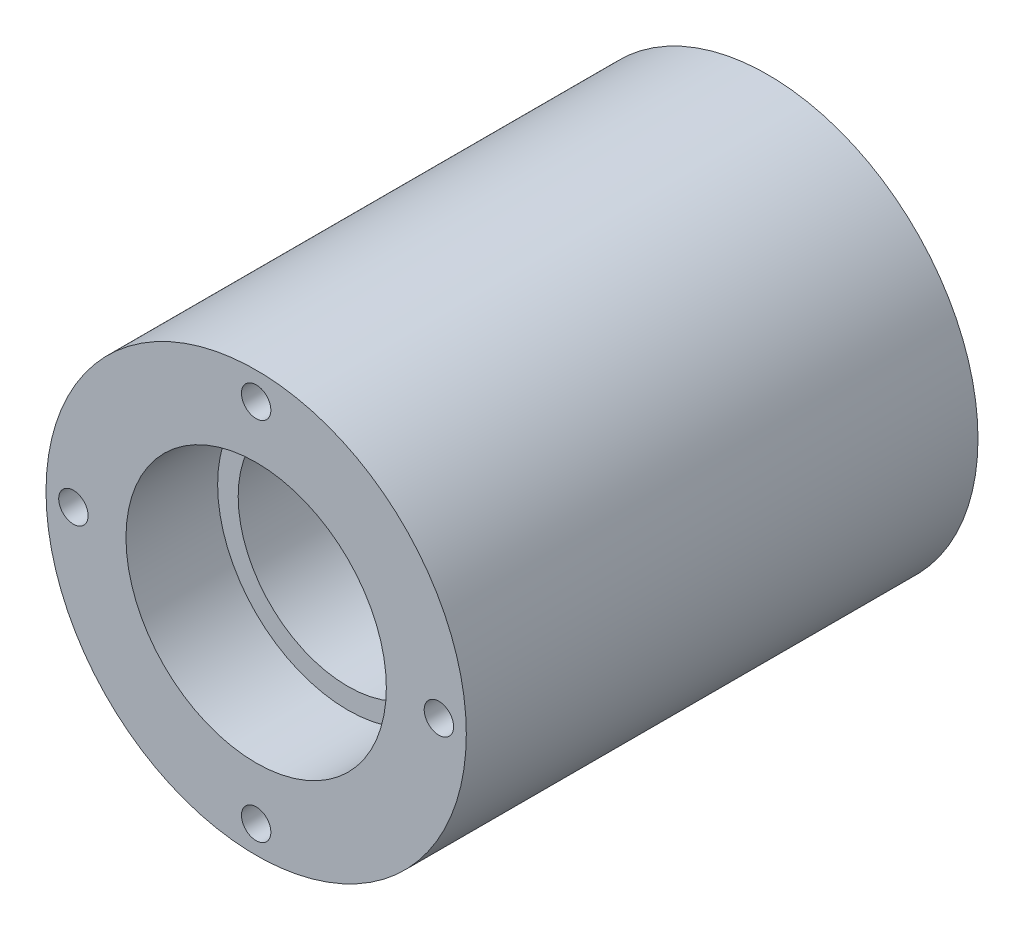
ISO-10303-21;
HEADER;
FILE_DESCRIPTION(('STEP AP214'),'2;1');
FILE_NAME('part.step','',(''),(''),'','','');
FILE_SCHEMA(('AUTOMOTIVE_DESIGN { 1 0 10303 214 1 1 1 1 }'));
ENDSEC;
DATA;
#1=APPLICATION_CONTEXT('core data for automotive mechanical design processes');
#2=APPLICATION_PROTOCOL_DEFINITION('international standard','automotive_design',2000,#1);
#3=PRODUCT_CONTEXT('',#1,'mechanical');
#4=PRODUCT('Part','Part','',(#3));
#5=PRODUCT_RELATED_PRODUCT_CATEGORY('part','',(#4));
#6=PRODUCT_DEFINITION_FORMATION('','',#4);
#7=PRODUCT_DEFINITION_CONTEXT('part definition',#1,'design');
#8=PRODUCT_DEFINITION('design','',#6,#7);
#9=PRODUCT_DEFINITION_SHAPE('','',#8);
#10=(LENGTH_UNIT() NAMED_UNIT(*) SI_UNIT(.MILLI.,.METRE.));
#11=(NAMED_UNIT(*) PLANE_ANGLE_UNIT() SI_UNIT($,.RADIAN.));
#12=(NAMED_UNIT(*) SI_UNIT($,.STERADIAN.) SOLID_ANGLE_UNIT());
#13=UNCERTAINTY_MEASURE_WITH_UNIT(LENGTH_MEASURE(1.E-05),#10,'distance_accuracy_value','');
#14=(GEOMETRIC_REPRESENTATION_CONTEXT(3) GLOBAL_UNCERTAINTY_ASSIGNED_CONTEXT((#13)) GLOBAL_UNIT_ASSIGNED_CONTEXT((#10,
#11,#12)) REPRESENTATION_CONTEXT('',''));
#15=CARTESIAN_POINT('',(0.,0.,0.));
#16=DIRECTION('',(0.,0.,1.));
#17=DIRECTION('',(1.,0.,0.));
#18=AXIS2_PLACEMENT_3D('',#15,#16,#17);
#19=CARTESIAN_POINT('',(0.,0.,44.45));
#20=DIRECTION('',(0.,0.,-1.));
#21=DIRECTION('',(-1.,0.,0.));
#22=AXIS2_PLACEMENT_3D('',#19,#20,#21);
#23=CYLINDRICAL_SURFACE('',#22,19.05);
#24=CARTESIAN_POINT('',(0.,0.,28.5242));
#25=DIRECTION('',(0.,0.,1.));
#26=DIRECTION('',(1.,0.,0.));
#27=AXIS2_PLACEMENT_3D('',#24,#25,#26);
#28=CIRCLE('',#27,19.05);
#29=CARTESIAN_POINT('',(19.05,0.,28.5242));
#30=VERTEX_POINT('',#29);
#31=EDGE_CURVE('E143',#30,#30,#28,.T.);
#32=ORIENTED_EDGE('',*,*,#31,.T.);
#33=EDGE_LOOP('',(#32));
#34=FACE_BOUND('',#33,.T.);
#35=CARTESIAN_POINT('',(0.,0.,-28.5242));
#36=DIRECTION('',(0.,0.,-1.));
#37=DIRECTION('',(-1.,0.,0.));
#38=AXIS2_PLACEMENT_3D('',#35,#36,#37);
#39=CIRCLE('',#38,19.05);
#40=CARTESIAN_POINT('',(-19.05,0.,-28.5242));
#41=VERTEX_POINT('',#40);
#42=EDGE_CURVE('E41',#41,#41,#39,.T.);
#43=ORIENTED_EDGE('',*,*,#42,.T.);
#44=EDGE_LOOP('',(#43));
#45=FACE_BOUND('',#44,.T.);
#46=ADVANCED_FACE('F37',(#34,#45),#23,.F.);
#47=CARTESIAN_POINT('',(0.,0.,-44.45));
#48=DIRECTION('',(0.,0.,1.));
#49=DIRECTION('',(1.,0.,0.));
#50=AXIS2_PLACEMENT_3D('',#47,#48,#49);
#51=PLANE('',#50);
#52=CARTESIAN_POINT('',(0.,31.75,-44.45));
#53=DIRECTION('',(0.,0.,-1.));
#54=DIRECTION('',(-1.,0.,0.));
#55=AXIS2_PLACEMENT_3D('',#52,#53,#54);
#56=CIRCLE('',#55,2.55269999999999);
#57=CARTESIAN_POINT('',(-2.55269999999999,31.75,-44.45));
#58=VERTEX_POINT('',#57);
#59=EDGE_CURVE('E80',#58,#58,#56,.T.);
#60=ORIENTED_EDGE('',*,*,#59,.F.);
#61=EDGE_LOOP('',(#60));
#62=FACE_BOUND('',#61,.T.);
#63=CARTESIAN_POINT('',(31.75,0.,-44.45));
#64=DIRECTION('',(0.,0.,-1.));
#65=DIRECTION('',(-1.,0.,0.));
#66=AXIS2_PLACEMENT_3D('',#63,#64,#65);
#67=CIRCLE('',#66,2.55269999999999);
#68=CARTESIAN_POINT('',(29.1973,0.,-44.45));
#69=VERTEX_POINT('',#68);
#70=EDGE_CURVE('E88',#69,#69,#67,.T.);
#71=ORIENTED_EDGE('',*,*,#70,.F.);
#72=EDGE_LOOP('',(#71));
#73=FACE_BOUND('',#72,.T.);
#74=CARTESIAN_POINT('',(0.,-31.75,-44.45));
#75=DIRECTION('',(0.,0.,-1.));
#76=DIRECTION('',(-1.,0.,0.));
#77=AXIS2_PLACEMENT_3D('',#74,#75,#76);
#78=CIRCLE('',#77,2.55269999999999);
#79=CARTESIAN_POINT('',(-2.55269999999999,-31.75,-44.45));
#80=VERTEX_POINT('',#79);
#81=EDGE_CURVE('E94',#80,#80,#78,.T.);
#82=ORIENTED_EDGE('',*,*,#81,.F.);
#83=EDGE_LOOP('',(#82));
#84=FACE_BOUND('',#83,.T.);
#85=CARTESIAN_POINT('',(-31.75,0.,-44.45));
#86=DIRECTION('',(0.,0.,-1.));
#87=DIRECTION('',(-1.,0.,0.));
#88=AXIS2_PLACEMENT_3D('',#85,#86,#87);
#89=CIRCLE('',#88,2.55269999999999);
#90=CARTESIAN_POINT('',(-34.3027,0.,-44.45));
#91=VERTEX_POINT('',#90);
#92=EDGE_CURVE('E100',#91,#91,#89,.T.);
#93=ORIENTED_EDGE('',*,*,#92,.F.);
#94=EDGE_LOOP('',(#93));
#95=FACE_BOUND('',#94,.T.);
#96=CARTESIAN_POINT('',(0.,0.,-44.45));
#97=DIRECTION('',(0.,0.,1.));
#98=DIRECTION('',(1.,0.,0.));
#99=AXIS2_PLACEMENT_3D('',#96,#97,#98);
#100=CIRCLE('',#99,36.5125);
#101=CARTESIAN_POINT('',(36.5125,0.,-44.45));
#102=VERTEX_POINT('',#101);
#103=EDGE_CURVE('E46',#102,#102,#100,.T.);
#104=ORIENTED_EDGE('',*,*,#103,.F.);
#105=EDGE_LOOP('',(#104));
#106=FACE_BOUND('',#105,.T.);
#107=CARTESIAN_POINT('',(0.,0.,-44.45));
#108=DIRECTION('',(0.,0.,1.));
#109=DIRECTION('',(1.,0.,0.));
#110=AXIS2_PLACEMENT_3D('',#107,#108,#109);
#111=CIRCLE('',#110,22.6187);
#112=CARTESIAN_POINT('',(22.6187,0.,-44.45));
#113=VERTEX_POINT('',#112);
#114=EDGE_CURVE('E103',#113,#113,#111,.T.);
#115=ORIENTED_EDGE('',*,*,#114,.T.);
#116=EDGE_LOOP('',(#115));
#117=FACE_BOUND('',#116,.T.);
#118=ADVANCED_FACE('F170',(#62,#73,#84,#95,#106,#117),#51,.F.);
#119=CARTESIAN_POINT('',(0.,0.,44.45));
#120=DIRECTION('',(0.,0.,1.));
#121=DIRECTION('',(1.,0.,0.));
#122=AXIS2_PLACEMENT_3D('',#119,#120,#121);
#123=PLANE('',#122);
#124=CARTESIAN_POINT('',(0.,31.75,44.45));
#125=DIRECTION('',(0.,0.,1.));
#126=DIRECTION('',(1.,0.,0.));
#127=AXIS2_PLACEMENT_3D('',#124,#125,#126);
#128=CIRCLE('',#127,2.55269999999999);
#129=CARTESIAN_POINT('',(2.55269999999999,31.75,44.45));
#130=VERTEX_POINT('',#129);
#131=EDGE_CURVE('E113',#130,#130,#128,.T.);
#132=ORIENTED_EDGE('',*,*,#131,.F.);
#133=EDGE_LOOP('',(#132));
#134=FACE_BOUND('',#133,.T.);
#135=CARTESIAN_POINT('',(31.75,0.,44.45));
#136=DIRECTION('',(0.,0.,1.));
#137=DIRECTION('',(1.,0.,0.));
#138=AXIS2_PLACEMENT_3D('',#135,#136,#137);
#139=CIRCLE('',#138,2.55269999999999);
#140=CARTESIAN_POINT('',(34.3027,0.,44.45));
#141=VERTEX_POINT('',#140);
#142=EDGE_CURVE('E123',#141,#141,#139,.T.);
#143=ORIENTED_EDGE('',*,*,#142,.F.);
#144=EDGE_LOOP('',(#143));
#145=FACE_BOUND('',#144,.T.);
#146=CARTESIAN_POINT('',(0.,-31.75,44.45));
#147=DIRECTION('',(0.,0.,1.));
#148=DIRECTION('',(1.,0.,0.));
#149=AXIS2_PLACEMENT_3D('',#146,#147,#148);
#150=CIRCLE('',#149,2.55269999999999);
#151=CARTESIAN_POINT('',(2.55269999999999,-31.75,44.45));
#152=VERTEX_POINT('',#151);
#153=EDGE_CURVE('E129',#152,#152,#150,.T.);
#154=ORIENTED_EDGE('',*,*,#153,.F.);
#155=EDGE_LOOP('',(#154));
#156=FACE_BOUND('',#155,.T.);
#157=CARTESIAN_POINT('',(-31.75,0.,44.45));
#158=DIRECTION('',(0.,0.,1.));
#159=DIRECTION('',(1.,0.,0.));
#160=AXIS2_PLACEMENT_3D('',#157,#158,#159);
#161=CIRCLE('',#160,2.55269999999999);
#162=CARTESIAN_POINT('',(-29.1973,0.,44.45));
#163=VERTEX_POINT('',#162);
#164=EDGE_CURVE('E136',#163,#163,#161,.T.);
#165=ORIENTED_EDGE('',*,*,#164,.F.);
#166=EDGE_LOOP('',(#165));
#167=FACE_BOUND('',#166,.T.);
#168=CARTESIAN_POINT('',(0.,0.,44.45));
#169=DIRECTION('',(0.,0.,1.));
#170=DIRECTION('',(1.,0.,0.));
#171=AXIS2_PLACEMENT_3D('',#168,#169,#170);
#172=CIRCLE('',#171,22.6187);
#173=CARTESIAN_POINT('',(22.6187,0.,44.45));
#174=VERTEX_POINT('',#173);
#175=EDGE_CURVE('E144',#174,#174,#172,.T.);
#176=ORIENTED_EDGE('',*,*,#175,.F.);
#177=EDGE_LOOP('',(#176));
#178=FACE_BOUND('',#177,.T.);
#179=CARTESIAN_POINT('',(0.,0.,44.45));
#180=DIRECTION('',(0.,0.,1.));
#181=DIRECTION('',(1.,0.,0.));
#182=AXIS2_PLACEMENT_3D('',#179,#180,#181);
#183=CIRCLE('',#182,36.5125);
#184=CARTESIAN_POINT('',(36.5125,0.,44.45));
#185=VERTEX_POINT('',#184);
#186=EDGE_CURVE('E12',#185,#185,#183,.T.);
#187=ORIENTED_EDGE('',*,*,#186,.T.);
#188=EDGE_LOOP('',(#187));
#189=FACE_BOUND('',#188,.T.);
#190=ADVANCED_FACE('F167',(#134,#145,#156,#167,#178,#189),#123,.T.);
#191=CARTESIAN_POINT('',(0.,0.,44.45));
#192=DIRECTION('',(0.,0.,-1.));
#193=DIRECTION('',(-1.,0.,0.));
#194=AXIS2_PLACEMENT_3D('',#191,#192,#193);
#195=CYLINDRICAL_SURFACE('',#194,36.5125);
#196=ORIENTED_EDGE('',*,*,#186,.F.);
#197=EDGE_LOOP('',(#196));
#198=FACE_BOUND('',#197,.T.);
#199=ORIENTED_EDGE('',*,*,#103,.T.);
#200=EDGE_LOOP('',(#199));
#201=FACE_BOUND('',#200,.T.);
#202=ADVANCED_FACE('F39',(#198,#201),#195,.T.);
#203=CARTESIAN_POINT('',(0.,0.,28.5242));
#204=DIRECTION('',(0.,0.,1.));
#205=DIRECTION('',(1.,0.,0.));
#206=AXIS2_PLACEMENT_3D('',#203,#204,#205);
#207=CYLINDRICAL_SURFACE('',#206,22.6187);
#208=CARTESIAN_POINT('',(0.,0.,28.5242));
#209=DIRECTION('',(0.,0.,1.));
#210=DIRECTION('',(1.,0.,0.));
#211=AXIS2_PLACEMENT_3D('',#208,#209,#210);
#212=CIRCLE('',#211,22.6187);
#213=CARTESIAN_POINT('',(22.6187,0.,28.5242));
#214=VERTEX_POINT('',#213);
#215=EDGE_CURVE('E139',#214,#214,#212,.T.);
#216=ORIENTED_EDGE('',*,*,#215,.F.);
#217=EDGE_LOOP('',(#216));
#218=FACE_BOUND('',#217,.T.);
#219=ORIENTED_EDGE('',*,*,#175,.T.);
#220=EDGE_LOOP('',(#219));
#221=FACE_BOUND('',#220,.T.);
#222=ADVANCED_FACE('F158',(#218,#221),#207,.F.);
#223=CARTESIAN_POINT('',(0.,0.,28.5242));
#224=DIRECTION('',(0.,0.,1.));
#225=DIRECTION('',(1.,0.,0.));
#226=AXIS2_PLACEMENT_3D('',#223,#224,#225);
#227=PLANE('',#226);
#228=ORIENTED_EDGE('',*,*,#31,.F.);
#229=EDGE_LOOP('',(#228));
#230=FACE_BOUND('',#229,.T.);
#231=ORIENTED_EDGE('',*,*,#215,.T.);
#232=EDGE_LOOP('',(#231));
#233=FACE_BOUND('',#232,.T.);
#234=ADVANCED_FACE('F154',(#230,#233),#227,.T.);
#235=CARTESIAN_POINT('',(-31.75,0.,44.45));
#236=DIRECTION('',(0.,0.,1.));
#237=DIRECTION('',(1.,0.,0.));
#238=AXIS2_PLACEMENT_3D('',#235,#236,#237);
#239=CYLINDRICAL_SURFACE('',#238,2.55269999999999);
#240=CARTESIAN_POINT('',(-31.75,0.,34.925));
#241=DIRECTION('',(0.,0.,1.));
#242=DIRECTION('',(1.,0.,0.));
#243=AXIS2_PLACEMENT_3D('',#240,#241,#242);
#244=CIRCLE('',#243,2.5527);
#245=CARTESIAN_POINT('',(-29.1973,0.,34.925));
#246=VERTEX_POINT('',#245);
#247=EDGE_CURVE('E132',#246,#246,#244,.T.);
#248=ORIENTED_EDGE('',*,*,#247,.F.);
#249=EDGE_LOOP('',(#248));
#250=FACE_BOUND('',#249,.T.);
#251=ORIENTED_EDGE('',*,*,#164,.T.);
#252=EDGE_LOOP('',(#251));
#253=FACE_BOUND('',#252,.T.);
#254=ADVANCED_FACE('F157',(#250,#253),#239,.F.);
#255=CARTESIAN_POINT('',(-31.75,0.,34.925));
#256=DIRECTION('',(0.,0.,1.));
#257=DIRECTION('',(1.,0.,0.));
#258=AXIS2_PLACEMENT_3D('',#255,#256,#257);
#259=CONICAL_SURFACE('',#258,2.5527,1.02974425867665);
#260=CARTESIAN_POINT('',(-31.75,0.,33.3911830978083));
#261=VERTEX_POINT('',#260);
#262=VERTEX_LOOP('',#261);
#263=FACE_BOUND('',#262,.T.);
#264=ORIENTED_EDGE('',*,*,#247,.T.);
#265=EDGE_LOOP('',(#264));
#266=FACE_BOUND('',#265,.T.);
#267=ADVANCED_FACE('F207',(#263,#266),#259,.F.);
#268=CARTESIAN_POINT('',(0.,-31.75,44.45));
#269=DIRECTION('',(0.,0.,1.));
#270=DIRECTION('',(1.,0.,0.));
#271=AXIS2_PLACEMENT_3D('',#268,#269,#270);
#272=CYLINDRICAL_SURFACE('',#271,2.55269999999999);
#273=CARTESIAN_POINT('',(0.,-31.75,34.925));
#274=DIRECTION('',(0.,0.,1.));
#275=DIRECTION('',(1.,0.,0.));
#276=AXIS2_PLACEMENT_3D('',#273,#274,#275);
#277=CIRCLE('',#276,2.5527);
#278=CARTESIAN_POINT('',(2.5527,-31.75,34.925));
#279=VERTEX_POINT('',#278);
#280=EDGE_CURVE('E125',#279,#279,#277,.T.);
#281=ORIENTED_EDGE('',*,*,#280,.F.);
#282=EDGE_LOOP('',(#281));
#283=FACE_BOUND('',#282,.T.);
#284=ORIENTED_EDGE('',*,*,#153,.T.);
#285=EDGE_LOOP('',(#284));
#286=FACE_BOUND('',#285,.T.);
#287=ADVANCED_FACE('F211',(#283,#286),#272,.F.);
#288=CARTESIAN_POINT('',(0.,-31.75,34.925));
#289=DIRECTION('',(0.,0.,1.));
#290=DIRECTION('',(1.,0.,0.));
#291=AXIS2_PLACEMENT_3D('',#288,#289,#290);
#292=CONICAL_SURFACE('',#291,2.5527,1.02974425867665);
#293=CARTESIAN_POINT('',(0.,-31.75,33.3911830978083));
#294=VERTEX_POINT('',#293);
#295=VERTEX_LOOP('',#294);
#296=FACE_BOUND('',#295,.T.);
#297=ORIENTED_EDGE('',*,*,#280,.T.);
#298=EDGE_LOOP('',(#297));
#299=FACE_BOUND('',#298,.T.);
#300=ADVANCED_FACE('F214',(#296,#299),#292,.F.);
#301=CARTESIAN_POINT('',(31.75,0.,44.45));
#302=DIRECTION('',(0.,0.,1.));
#303=DIRECTION('',(1.,0.,0.));
#304=AXIS2_PLACEMENT_3D('',#301,#302,#303);
#305=CYLINDRICAL_SURFACE('',#304,2.55269999999999);
#306=CARTESIAN_POINT('',(31.75,0.,34.925));
#307=DIRECTION('',(0.,0.,1.));
#308=DIRECTION('',(1.,0.,0.));
#309=AXIS2_PLACEMENT_3D('',#306,#307,#308);
#310=CIRCLE('',#309,2.5527);
#311=CARTESIAN_POINT('',(34.3027,0.,34.925));
#312=VERTEX_POINT('',#311);
#313=EDGE_CURVE('E119',#312,#312,#310,.T.);
#314=ORIENTED_EDGE('',*,*,#313,.F.);
#315=EDGE_LOOP('',(#314));
#316=FACE_BOUND('',#315,.T.);
#317=ORIENTED_EDGE('',*,*,#142,.T.);
#318=EDGE_LOOP('',(#317));
#319=FACE_BOUND('',#318,.T.);
#320=ADVANCED_FACE('F218',(#316,#319),#305,.F.);
#321=CARTESIAN_POINT('',(31.75,0.,34.925));
#322=DIRECTION('',(0.,0.,1.));
#323=DIRECTION('',(1.,0.,0.));
#324=AXIS2_PLACEMENT_3D('',#321,#322,#323);
#325=CONICAL_SURFACE('',#324,2.5527,1.02974425867665);
#326=CARTESIAN_POINT('',(31.75,0.,33.3911830978083));
#327=VERTEX_POINT('',#326);
#328=VERTEX_LOOP('',#327);
#329=FACE_BOUND('',#328,.T.);
#330=ORIENTED_EDGE('',*,*,#313,.T.);
#331=EDGE_LOOP('',(#330));
#332=FACE_BOUND('',#331,.T.);
#333=ADVANCED_FACE('F221',(#329,#332),#325,.F.);
#334=CARTESIAN_POINT('',(0.,31.75,44.45));
#335=DIRECTION('',(0.,0.,1.));
#336=DIRECTION('',(1.,0.,0.));
#337=AXIS2_PLACEMENT_3D('',#334,#335,#336);
#338=CYLINDRICAL_SURFACE('',#337,2.55269999999999);
#339=CARTESIAN_POINT('',(0.,31.75,34.925));
#340=DIRECTION('',(0.,0.,1.));
#341=DIRECTION('',(1.,0.,0.));
#342=AXIS2_PLACEMENT_3D('',#339,#340,#341);
#343=CIRCLE('',#342,2.5527);
#344=CARTESIAN_POINT('',(2.5527,31.75,34.925));
#345=VERTEX_POINT('',#344);
#346=EDGE_CURVE('E109',#345,#345,#343,.T.);
#347=ORIENTED_EDGE('',*,*,#346,.F.);
#348=EDGE_LOOP('',(#347));
#349=FACE_BOUND('',#348,.T.);
#350=ORIENTED_EDGE('',*,*,#131,.T.);
#351=EDGE_LOOP('',(#350));
#352=FACE_BOUND('',#351,.T.);
#353=ADVANCED_FACE('F197',(#349,#352),#338,.F.);
#354=CARTESIAN_POINT('',(0.,31.75,34.925));
#355=DIRECTION('',(0.,0.,1.));
#356=DIRECTION('',(1.,0.,0.));
#357=AXIS2_PLACEMENT_3D('',#354,#355,#356);
#358=CONICAL_SURFACE('',#357,2.5527,1.02974425867665);
#359=CARTESIAN_POINT('',(0.,31.75,33.3911830978083));
#360=VERTEX_POINT('',#359);
#361=VERTEX_LOOP('',#360);
#362=FACE_BOUND('',#361,.T.);
#363=ORIENTED_EDGE('',*,*,#346,.T.);
#364=EDGE_LOOP('',(#363));
#365=FACE_BOUND('',#364,.T.);
#366=ADVANCED_FACE('F187',(#362,#365),#358,.F.);
#367=CARTESIAN_POINT('',(0.,0.,-28.5242));
#368=DIRECTION('',(0.,0.,-1.));
#369=DIRECTION('',(-1.,0.,0.));
#370=AXIS2_PLACEMENT_3D('',#367,#368,#369);
#371=CYLINDRICAL_SURFACE('',#370,22.6187);
#372=CARTESIAN_POINT('',(0.,0.,-28.5242));
#373=DIRECTION('',(0.,0.,1.));
#374=DIRECTION('',(1.,0.,0.));
#375=AXIS2_PLACEMENT_3D('',#372,#373,#374);
#376=CIRCLE('',#375,22.6187);
#377=CARTESIAN_POINT('',(22.6187,0.,-28.5242));
#378=VERTEX_POINT('',#377);
#379=EDGE_CURVE('E104',#378,#378,#376,.T.);
#380=ORIENTED_EDGE('',*,*,#379,.T.);
#381=EDGE_LOOP('',(#380));
#382=FACE_BOUND('',#381,.T.);
#383=ORIENTED_EDGE('',*,*,#114,.F.);
#384=EDGE_LOOP('',(#383));
#385=FACE_BOUND('',#384,.T.);
#386=ADVANCED_FACE('F184',(#382,#385),#371,.F.);
#387=CARTESIAN_POINT('',(0.,0.,-28.5242));
#388=DIRECTION('',(0.,0.,-1.));
#389=DIRECTION('',(1.,0.,0.));
#390=AXIS2_PLACEMENT_3D('',#387,#388,#389);
#391=PLANE('',#390);
#392=ORIENTED_EDGE('',*,*,#42,.F.);
#393=EDGE_LOOP('',(#392));
#394=FACE_BOUND('',#393,.T.);
#395=ORIENTED_EDGE('',*,*,#379,.F.);
#396=EDGE_LOOP('',(#395));
#397=FACE_BOUND('',#396,.T.);
#398=ADVANCED_FACE('F186',(#394,#397),#391,.T.);
#399=CARTESIAN_POINT('',(-31.75,0.,-44.45));
#400=DIRECTION('',(0.,0.,-1.));
#401=DIRECTION('',(-1.,0.,0.));
#402=AXIS2_PLACEMENT_3D('',#399,#400,#401);
#403=CYLINDRICAL_SURFACE('',#402,2.55269999999999);
#404=CARTESIAN_POINT('',(-31.75,0.,-34.925));
#405=DIRECTION('',(0.,0.,-1.));
#406=DIRECTION('',(-1.,0.,0.));
#407=AXIS2_PLACEMENT_3D('',#404,#405,#406);
#408=CIRCLE('',#407,2.5527);
#409=CARTESIAN_POINT('',(-34.3027,0.,-34.925));
#410=VERTEX_POINT('',#409);
#411=EDGE_CURVE('E97',#410,#410,#408,.T.);
#412=ORIENTED_EDGE('',*,*,#411,.F.);
#413=EDGE_LOOP('',(#412));
#414=FACE_BOUND('',#413,.T.);
#415=ORIENTED_EDGE('',*,*,#92,.T.);
#416=EDGE_LOOP('',(#415));
#417=FACE_BOUND('',#416,.T.);
#418=ADVANCED_FACE('F194',(#414,#417),#403,.F.);
#419=CARTESIAN_POINT('',(-31.75,0.,-34.925));
#420=DIRECTION('',(0.,0.,-1.));
#421=DIRECTION('',(-1.,0.,0.));
#422=AXIS2_PLACEMENT_3D('',#419,#420,#421);
#423=CONICAL_SURFACE('',#422,2.5527,1.02974425867665);
#424=CARTESIAN_POINT('',(-31.75,0.,-33.3911830978083));
#425=VERTEX_POINT('',#424);
#426=VERTEX_LOOP('',#425);
#427=FACE_BOUND('',#426,.T.);
#428=ORIENTED_EDGE('',*,*,#411,.T.);
#429=EDGE_LOOP('',(#428));
#430=FACE_BOUND('',#429,.T.);
#431=ADVANCED_FACE('F284',(#427,#430),#423,.F.);
#432=CARTESIAN_POINT('',(0.,-31.75,-44.45));
#433=DIRECTION('',(0.,0.,-1.));
#434=DIRECTION('',(-1.,0.,0.));
#435=AXIS2_PLACEMENT_3D('',#432,#433,#434);
#436=CYLINDRICAL_SURFACE('',#435,2.55269999999999);
#437=CARTESIAN_POINT('',(0.,-31.75,-34.925));
#438=DIRECTION('',(0.,0.,-1.));
#439=DIRECTION('',(-1.,0.,0.));
#440=AXIS2_PLACEMENT_3D('',#437,#438,#439);
#441=CIRCLE('',#440,2.5527);
#442=CARTESIAN_POINT('',(-2.5527,-31.75,-34.925));
#443=VERTEX_POINT('',#442);
#444=EDGE_CURVE('E91',#443,#443,#441,.T.);
#445=ORIENTED_EDGE('',*,*,#444,.F.);
#446=EDGE_LOOP('',(#445));
#447=FACE_BOUND('',#446,.T.);
#448=ORIENTED_EDGE('',*,*,#81,.T.);
#449=EDGE_LOOP('',(#448));
#450=FACE_BOUND('',#449,.T.);
#451=ADVANCED_FACE('F295',(#447,#450),#436,.F.);
#452=CARTESIAN_POINT('',(0.,-31.75,-34.925));
#453=DIRECTION('',(0.,0.,-1.));
#454=DIRECTION('',(-1.,0.,0.));
#455=AXIS2_PLACEMENT_3D('',#452,#453,#454);
#456=CONICAL_SURFACE('',#455,2.5527,1.02974425867665);
#457=CARTESIAN_POINT('',(0.,-31.75,-33.3911830978083));
#458=VERTEX_POINT('',#457);
#459=VERTEX_LOOP('',#458);
#460=FACE_BOUND('',#459,.T.);
#461=ORIENTED_EDGE('',*,*,#444,.T.);
#462=EDGE_LOOP('',(#461));
#463=FACE_BOUND('',#462,.T.);
#464=ADVANCED_FACE('F305',(#460,#463),#456,.F.);
#465=CARTESIAN_POINT('',(31.75,0.,-44.45));
#466=DIRECTION('',(0.,0.,-1.));
#467=DIRECTION('',(-1.,0.,0.));
#468=AXIS2_PLACEMENT_3D('',#465,#466,#467);
#469=CYLINDRICAL_SURFACE('',#468,2.55269999999999);
#470=CARTESIAN_POINT('',(31.75,0.,-34.925));
#471=DIRECTION('',(0.,0.,-1.));
#472=DIRECTION('',(-1.,0.,0.));
#473=AXIS2_PLACEMENT_3D('',#470,#471,#472);
#474=CIRCLE('',#473,2.5527);
#475=CARTESIAN_POINT('',(29.1973,0.,-34.925));
#476=VERTEX_POINT('',#475);
#477=EDGE_CURVE('E83',#476,#476,#474,.T.);
#478=ORIENTED_EDGE('',*,*,#477,.F.);
#479=EDGE_LOOP('',(#478));
#480=FACE_BOUND('',#479,.T.);
#481=ORIENTED_EDGE('',*,*,#70,.T.);
#482=EDGE_LOOP('',(#481));
#483=FACE_BOUND('',#482,.T.);
#484=ADVANCED_FACE('F316',(#480,#483),#469,.F.);
#485=CARTESIAN_POINT('',(31.75,0.,-34.925));
#486=DIRECTION('',(0.,0.,-1.));
#487=DIRECTION('',(-1.,0.,0.));
#488=AXIS2_PLACEMENT_3D('',#485,#486,#487);
#489=CONICAL_SURFACE('',#488,2.5527,1.02974425867665);
#490=CARTESIAN_POINT('',(31.75,0.,-33.3911830978083));
#491=VERTEX_POINT('',#490);
#492=VERTEX_LOOP('',#491);
#493=FACE_BOUND('',#492,.T.);
#494=ORIENTED_EDGE('',*,*,#477,.T.);
#495=EDGE_LOOP('',(#494));
#496=FACE_BOUND('',#495,.T.);
#497=ADVANCED_FACE('F326',(#493,#496),#489,.F.);
#498=CARTESIAN_POINT('',(0.,31.75,-44.45));
#499=DIRECTION('',(0.,0.,-1.));
#500=DIRECTION('',(-1.,0.,0.));
#501=AXIS2_PLACEMENT_3D('',#498,#499,#500);
#502=CYLINDRICAL_SURFACE('',#501,2.55269999999999);
#503=CARTESIAN_POINT('',(0.,31.75,-34.925));
#504=DIRECTION('',(0.,0.,-1.));
#505=DIRECTION('',(-1.,0.,0.));
#506=AXIS2_PLACEMENT_3D('',#503,#504,#505);
#507=CIRCLE('',#506,2.5527);
#508=CARTESIAN_POINT('',(-2.5527,31.75,-34.925));
#509=VERTEX_POINT('',#508);
#510=EDGE_CURVE('E78',#509,#509,#507,.T.);
#511=ORIENTED_EDGE('',*,*,#510,.F.);
#512=EDGE_LOOP('',(#511));
#513=FACE_BOUND('',#512,.T.);
#514=ORIENTED_EDGE('',*,*,#59,.T.);
#515=EDGE_LOOP('',(#514));
#516=FACE_BOUND('',#515,.T.);
#517=ADVANCED_FACE('F74',(#513,#516),#502,.F.);
#518=CARTESIAN_POINT('',(0.,31.75,-34.925));
#519=DIRECTION('',(0.,0.,-1.));
#520=DIRECTION('',(-1.,0.,0.));
#521=AXIS2_PLACEMENT_3D('',#518,#519,#520);
#522=CONICAL_SURFACE('',#521,2.5527,1.02974425867665);
#523=CARTESIAN_POINT('',(0.,31.75,-33.3911830978083));
#524=VERTEX_POINT('',#523);
#525=VERTEX_LOOP('',#524);
#526=FACE_BOUND('',#525,.T.);
#527=ORIENTED_EDGE('',*,*,#510,.T.);
#528=EDGE_LOOP('',(#527));
#529=FACE_BOUND('',#528,.T.);
#530=ADVANCED_FACE('F71',(#526,#529),#522,.F.);
#531=CLOSED_SHELL('',(#46,#118,#190,#202,#222,#234,#254,#267,#287,#300,#320,#333,#353,#366,#386,
#398,#418,#431,#451,#464,#484,#497,#517,#530));
#532=MANIFOLD_SOLID_BREP('B2',#531);
#533=ADVANCED_BREP_SHAPE_REPRESENTATION('',(#18,#532),#14);
#534=SHAPE_DEFINITION_REPRESENTATION(#9,#533);
ENDSEC;
END-ISO-10303-21;
